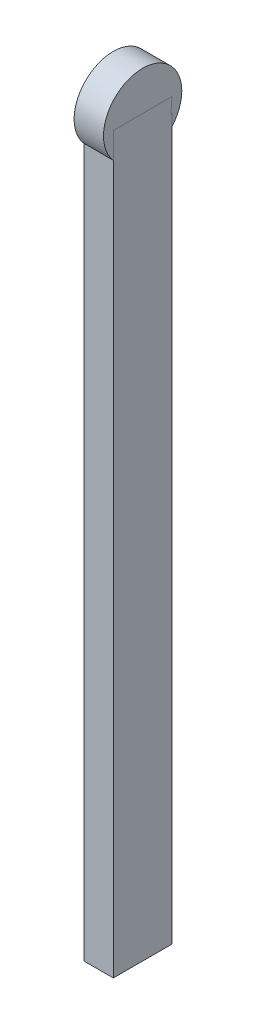
ISO-10303-21;
HEADER;
FILE_DESCRIPTION(('STEP AP214'),'2;1');
FILE_NAME('part.step','',(''),(''),'','','');
FILE_SCHEMA(('AUTOMOTIVE_DESIGN { 1 0 10303 214 1 1 1 1 }'));
ENDSEC;
DATA;
#1=APPLICATION_CONTEXT('core data for automotive mechanical design processes');
#2=APPLICATION_PROTOCOL_DEFINITION('international standard','automotive_design',2000,#1);
#3=PRODUCT_CONTEXT('',#1,'mechanical');
#4=PRODUCT('Part','Part','',(#3));
#5=PRODUCT_RELATED_PRODUCT_CATEGORY('part','',(#4));
#6=PRODUCT_DEFINITION_FORMATION('','',#4);
#7=PRODUCT_DEFINITION_CONTEXT('part definition',#1,'design');
#8=PRODUCT_DEFINITION('design','',#6,#7);
#9=PRODUCT_DEFINITION_SHAPE('','',#8);
#10=(LENGTH_UNIT() NAMED_UNIT(*) SI_UNIT(.MILLI.,.METRE.));
#11=(NAMED_UNIT(*) PLANE_ANGLE_UNIT() SI_UNIT($,.RADIAN.));
#12=(NAMED_UNIT(*) SI_UNIT($,.STERADIAN.) SOLID_ANGLE_UNIT());
#13=UNCERTAINTY_MEASURE_WITH_UNIT(LENGTH_MEASURE(1.E-05),#10,'distance_accuracy_value','');
#14=(GEOMETRIC_REPRESENTATION_CONTEXT(3) GLOBAL_UNCERTAINTY_ASSIGNED_CONTEXT((#13)) GLOBAL_UNIT_ASSIGNED_CONTEXT((#10,
#11,#12)) REPRESENTATION_CONTEXT('',''));
#15=CARTESIAN_POINT('',(0.,0.,0.));
#16=DIRECTION('',(0.,0.,1.));
#17=DIRECTION('',(1.,0.,0.));
#18=AXIS2_PLACEMENT_3D('',#15,#16,#17);
#19=CARTESIAN_POINT('',(0.,0.,12.));
#20=DIRECTION('',(0.,0.,1.));
#21=DIRECTION('',(1.,0.,0.));
#22=AXIS2_PLACEMENT_3D('',#19,#20,#21);
#23=PLANE('',#22);
#24=DIRECTION('',(-1.,0.,0.));
#25=VECTOR('',#24,1.);
#26=CARTESIAN_POINT('',(0.,-75.,12.));
#27=LINE('',#26,#25);
#28=CARTESIAN_POINT('',(3.,-75.,12.));
#29=VERTEX_POINT('',#28);
#30=CARTESIAN_POINT('',(-3.,-75.,12.));
#31=VERTEX_POINT('',#30);
#32=EDGE_CURVE('P0_E11',#29,#31,#27,.T.);
#33=ORIENTED_EDGE('',*,*,#32,.F.);
#34=DIRECTION('',(0.,-1.,0.));
#35=VECTOR('',#34,1.);
#36=CARTESIAN_POINT('',(3.,0.,12.));
#37=LINE('',#36,#35);
#38=CARTESIAN_POINT('',(3.,75.,12.));
#39=VERTEX_POINT('',#38);
#40=EDGE_CURVE('P0_E62',#39,#29,#37,.T.);
#41=ORIENTED_EDGE('',*,*,#40,.F.);
#42=DIRECTION('',(1.,0.,0.));
#43=VECTOR('',#42,1.);
#44=CARTESIAN_POINT('',(0.,75.,12.));
#45=LINE('',#44,#43);
#46=CARTESIAN_POINT('',(-3.,75.,12.));
#47=VERTEX_POINT('',#46);
#48=EDGE_CURVE('P0_E98',#47,#39,#45,.T.);
#49=ORIENTED_EDGE('',*,*,#48,.F.);
#50=DIRECTION('',(0.,1.,0.));
#51=VECTOR('',#50,1.);
#52=CARTESIAN_POINT('',(-3.,0.,12.));
#53=LINE('',#52,#51);
#54=EDGE_CURVE('P0_E25',#31,#47,#53,.T.);
#55=ORIENTED_EDGE('',*,*,#54,.F.);
#56=EDGE_LOOP('',(#33,#41,#49,#55));
#57=FACE_BOUND('',#56,.T.);
#58=ADVANCED_FACE('P0_F17',(#57),#23,.T.);
#59=CARTESIAN_POINT('',(0.,-75.,0.));
#60=DIRECTION('',(0.,-1.,0.));
#61=DIRECTION('',(0.,0.,-1.));
#62=AXIS2_PLACEMENT_3D('',#59,#60,#61);
#63=PLANE('',#62);
#64=DIRECTION('',(0.,0.,1.));
#65=VECTOR('',#64,1.);
#66=CARTESIAN_POINT('',(3.,-75.,0.));
#67=LINE('',#66,#65);
#68=CARTESIAN_POINT('',(3.,-75.,0.));
#69=VERTEX_POINT('',#68);
#70=EDGE_CURVE('P0_E55',#69,#29,#67,.T.);
#71=ORIENTED_EDGE('',*,*,#70,.T.);
#72=ORIENTED_EDGE('',*,*,#32,.T.);
#73=DIRECTION('',(0.,0.,1.));
#74=VECTOR('',#73,1.);
#75=CARTESIAN_POINT('',(-3.,-75.,0.));
#76=LINE('',#75,#74);
#77=CARTESIAN_POINT('',(-3.,-75.,0.));
#78=VERTEX_POINT('',#77);
#79=EDGE_CURVE('P0_E69',#78,#31,#76,.T.);
#80=ORIENTED_EDGE('',*,*,#79,.F.);
#81=DIRECTION('',(1.,0.,0.));
#82=VECTOR('',#81,1.);
#83=CARTESIAN_POINT('',(0.,-75.,0.));
#84=LINE('',#83,#82);
#85=EDGE_CURVE('P0_E67',#78,#69,#84,.T.);
#86=ORIENTED_EDGE('',*,*,#85,.T.);
#87=EDGE_LOOP('',(#71,#72,#80,#86));
#88=FACE_BOUND('',#87,.T.);
#89=ADVANCED_FACE('P0_F68',(#88),#63,.T.);
#90=CARTESIAN_POINT('',(-3.,0.,0.));
#91=DIRECTION('',(-1.,0.,0.));
#92=DIRECTION('',(0.,0.,1.));
#93=AXIS2_PLACEMENT_3D('',#90,#91,#92);
#94=PLANE('',#93);
#95=ORIENTED_EDGE('',*,*,#79,.T.);
#96=ORIENTED_EDGE('',*,*,#54,.T.);
#97=DIRECTION('',(0.,0.,1.));
#98=VECTOR('',#97,1.);
#99=CARTESIAN_POINT('',(-3.,75.,0.));
#100=LINE('',#99,#98);
#101=CARTESIAN_POINT('',(-3.,75.,0.));
#102=VERTEX_POINT('',#101);
#103=EDGE_CURVE('P0_E91',#102,#47,#100,.T.);
#104=ORIENTED_EDGE('',*,*,#103,.F.);
#105=DIRECTION('',(0.,-1.,0.));
#106=VECTOR('',#105,1.);
#107=CARTESIAN_POINT('',(-3.,0.,0.));
#108=LINE('',#107,#106);
#109=EDGE_CURVE('P0_E74',#102,#78,#108,.T.);
#110=ORIENTED_EDGE('',*,*,#109,.T.);
#111=EDGE_LOOP('',(#95,#96,#104,#110));
#112=FACE_BOUND('',#111,.T.);
#113=ADVANCED_FACE('P0_F106',(#112),#94,.T.);
#114=CARTESIAN_POINT('',(0.,75.,0.));
#115=DIRECTION('',(0.,1.,0.));
#116=DIRECTION('',(0.,0.,1.));
#117=AXIS2_PLACEMENT_3D('',#114,#115,#116);
#118=PLANE('',#117);
#119=ORIENTED_EDGE('',*,*,#103,.T.);
#120=ORIENTED_EDGE('',*,*,#48,.T.);
#121=DIRECTION('',(0.,0.,1.));
#122=VECTOR('',#121,1.);
#123=CARTESIAN_POINT('',(3.,75.,0.));
#124=LINE('',#123,#122);
#125=CARTESIAN_POINT('',(3.,75.,0.));
#126=VERTEX_POINT('',#125);
#127=EDGE_CURVE('P0_E64',#126,#39,#124,.T.);
#128=ORIENTED_EDGE('',*,*,#127,.F.);
#129=DIRECTION('',(-1.,0.,0.));
#130=VECTOR('',#129,1.);
#131=CARTESIAN_POINT('',(0.,75.,0.));
#132=LINE('',#131,#130);
#133=EDGE_CURVE('P0_E79',#126,#102,#132,.T.);
#134=ORIENTED_EDGE('',*,*,#133,.T.);
#135=EDGE_LOOP('',(#119,#120,#128,#134));
#136=FACE_BOUND('',#135,.T.);
#137=ADVANCED_FACE('P0_F104',(#136),#118,.T.);
#138=CARTESIAN_POINT('',(0.,0.,0.));
#139=DIRECTION('',(0.,0.,-1.));
#140=DIRECTION('',(-1.,0.,0.));
#141=AXIS2_PLACEMENT_3D('',#138,#139,#140);
#142=PLANE('',#141);
#143=DIRECTION('',(0.,1.,0.));
#144=VECTOR('',#143,1.);
#145=CARTESIAN_POINT('',(3.,0.,0.));
#146=LINE('',#145,#144);
#147=EDGE_CURVE('P0_E60',#69,#126,#146,.T.);
#148=ORIENTED_EDGE('',*,*,#147,.F.);
#149=ORIENTED_EDGE('',*,*,#85,.F.);
#150=ORIENTED_EDGE('',*,*,#109,.F.);
#151=ORIENTED_EDGE('',*,*,#133,.F.);
#152=EDGE_LOOP('',(#148,#149,#150,#151));
#153=FACE_BOUND('',#152,.T.);
#154=ADVANCED_FACE('P0_F77',(#153),#142,.T.);
#155=CARTESIAN_POINT('',(3.,0.,0.));
#156=DIRECTION('',(1.,0.,0.));
#157=DIRECTION('',(0.,0.,-1.));
#158=AXIS2_PLACEMENT_3D('',#155,#156,#157);
#159=PLANE('',#158);
#160=ORIENTED_EDGE('',*,*,#147,.T.);
#161=ORIENTED_EDGE('',*,*,#127,.T.);
#162=ORIENTED_EDGE('',*,*,#40,.T.);
#163=ORIENTED_EDGE('',*,*,#70,.F.);
#164=EDGE_LOOP('',(#160,#161,#162,#163));
#165=FACE_BOUND('',#164,.T.);
#166=ADVANCED_FACE('P0_F57',(#165),#159,.T.);
#167=CLOSED_SHELL('',(#58,#89,#113,#137,#154,#166));
#168=MANIFOLD_SOLID_BREP('P0_B1',#167);
#169=CARTESIAN_POINT('',(3.,75.,6.));
#170=DIRECTION('',(1.,0.,0.));
#171=DIRECTION('',(0.,0.,-1.));
#172=AXIS2_PLACEMENT_3D('',#169,#170,#171);
#173=PLANE('',#172);
#174=CARTESIAN_POINT('',(3.,75.,6.));
#175=DIRECTION('',(-1.,0.,0.));
#176=DIRECTION('',(0.,0.,1.));
#177=AXIS2_PLACEMENT_3D('',#174,#175,#176);
#178=CIRCLE('',#177,8.);
#179=CARTESIAN_POINT('',(3.,75.,14.));
#180=VERTEX_POINT('',#179);
#181=EDGE_CURVE('P1_E10',#180,#180,#178,.T.);
#182=ORIENTED_EDGE('',*,*,#181,.F.);
#183=EDGE_LOOP('',(#182));
#184=FACE_BOUND('',#183,.T.);
#185=ADVANCED_FACE('P1_F15',(#184),#173,.T.);
#186=CARTESIAN_POINT('',(-3.,75.,6.));
#187=DIRECTION('',(-1.,0.,0.));
#188=DIRECTION('',(0.,0.,1.));
#189=AXIS2_PLACEMENT_3D('',#186,#187,#188);
#190=PLANE('',#189);
#191=CARTESIAN_POINT('',(-3.,75.,6.));
#192=DIRECTION('',(1.,0.,0.));
#193=DIRECTION('',(0.,0.,-1.));
#194=AXIS2_PLACEMENT_3D('',#191,#192,#193);
#195=CIRCLE('',#194,8.);
#196=CARTESIAN_POINT('',(-3.,75.,-2.));
#197=VERTEX_POINT('',#196);
#198=EDGE_CURVE('P1_E23',#197,#197,#195,.T.);
#199=ORIENTED_EDGE('',*,*,#198,.F.);
#200=EDGE_LOOP('',(#199));
#201=FACE_BOUND('',#200,.T.);
#202=ADVANCED_FACE('P1_F32',(#201),#190,.T.);
#203=CARTESIAN_POINT('',(-3.,75.,6.));
#204=DIRECTION('',(1.,0.,0.));
#205=DIRECTION('',(0.,0.,-1.));
#206=AXIS2_PLACEMENT_3D('',#203,#204,#205);
#207=CYLINDRICAL_SURFACE('',#206,8.);
#208=ORIENTED_EDGE('',*,*,#181,.T.);
#209=EDGE_LOOP('',(#208));
#210=FACE_BOUND('',#209,.T.);
#211=ORIENTED_EDGE('',*,*,#198,.T.);
#212=EDGE_LOOP('',(#211));
#213=FACE_BOUND('',#212,.T.);
#214=ADVANCED_FACE('P1_F17',(#210,#213),#207,.T.);
#215=CLOSED_SHELL('',(#185,#202,#214));
#216=MANIFOLD_SOLID_BREP('P1_B1',#215);
#217=ADVANCED_BREP_SHAPE_REPRESENTATION('',(#18,#168,#216),#14);
#218=SHAPE_DEFINITION_REPRESENTATION(#9,#217);
ENDSEC;
END-ISO-10303-21;
